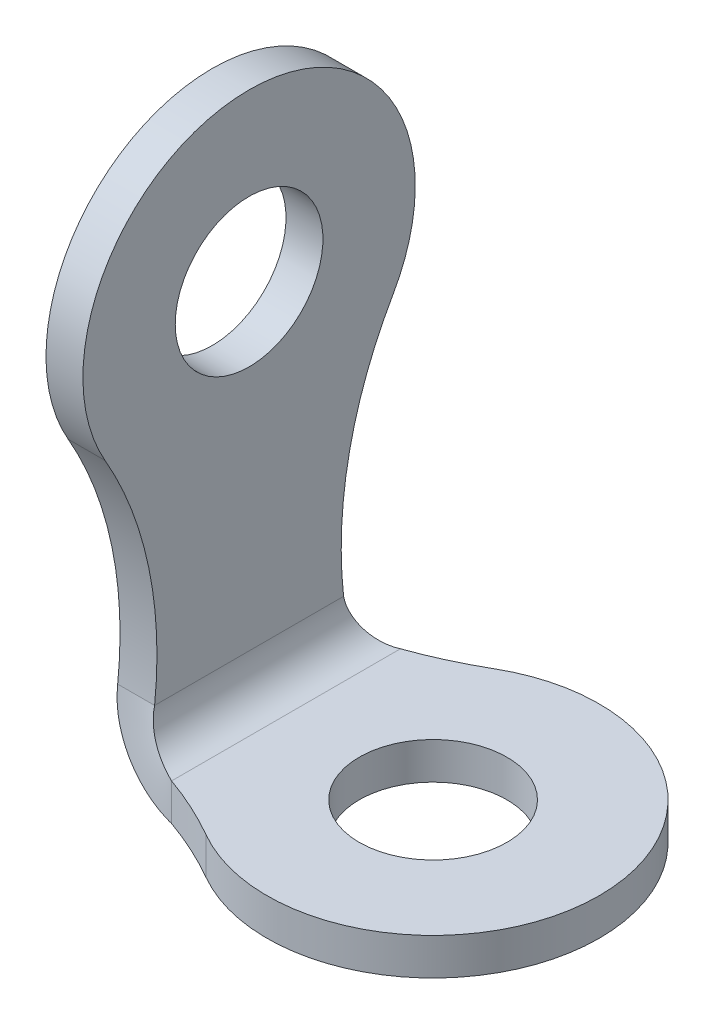
ISO-10303-21;
HEADER;
FILE_DESCRIPTION(('STEP AP214'),'2;1');
FILE_NAME('part.step','',(''),(''),'','','');
FILE_SCHEMA(('AUTOMOTIVE_DESIGN { 1 0 10303 214 1 1 1 1 }'));
ENDSEC;
DATA;
#1=APPLICATION_CONTEXT('core data for automotive mechanical design processes');
#2=APPLICATION_PROTOCOL_DEFINITION('international standard','automotive_design',2000,#1);
#3=PRODUCT_CONTEXT('',#1,'mechanical');
#4=PRODUCT('Part','Part','',(#3));
#5=PRODUCT_RELATED_PRODUCT_CATEGORY('part','',(#4));
#6=PRODUCT_DEFINITION_FORMATION('','',#4);
#7=PRODUCT_DEFINITION_CONTEXT('part definition',#1,'design');
#8=PRODUCT_DEFINITION('design','',#6,#7);
#9=PRODUCT_DEFINITION_SHAPE('','',#8);
#10=(LENGTH_UNIT() NAMED_UNIT(*) SI_UNIT(.MILLI.,.METRE.));
#11=(NAMED_UNIT(*) PLANE_ANGLE_UNIT() SI_UNIT($,.RADIAN.));
#12=(NAMED_UNIT(*) SI_UNIT($,.STERADIAN.) SOLID_ANGLE_UNIT());
#13=UNCERTAINTY_MEASURE_WITH_UNIT(LENGTH_MEASURE(1.E-05),#10,'distance_accuracy_value','');
#14=(GEOMETRIC_REPRESENTATION_CONTEXT(3) GLOBAL_UNCERTAINTY_ASSIGNED_CONTEXT((#13)) GLOBAL_UNIT_ASSIGNED_CONTEXT((#10,
#11,#12)) REPRESENTATION_CONTEXT('',''));
#15=CARTESIAN_POINT('',(0.,0.,0.));
#16=DIRECTION('',(0.,0.,1.));
#17=DIRECTION('',(1.,0.,0.));
#18=AXIS2_PLACEMENT_3D('',#15,#16,#17);
#19=CARTESIAN_POINT('',(1.51644888372476,2.16025439353241,-13.0247581574486));
#20=DIRECTION('',(1.,0.,0.));
#21=DIRECTION('',(0.,0.,1.));
#22=AXIS2_PLACEMENT_3D('',#19,#20,#21);
#23=CYLINDRICAL_SURFACE('',#22,10.529781271197);
#24=CARTESIAN_POINT('',(2.51644888372476,2.16025439353241,-13.0247581574486));
#25=DIRECTION('',(-1.,0.,0.));
#26=DIRECTION('',(0.,0.,1.));
#27=AXIS2_PLACEMENT_3D('',#24,#25,#26);
#28=CIRCLE('',#27,10.529781271197);
#29=CARTESIAN_POINT('',(2.51644888372476,1.,-2.55909509381333));
#30=VERTEX_POINT('',#29);
#31=CARTESIAN_POINT('',(2.51644888372478,7.41471273254508,-3.89968494224473));
#32=VERTEX_POINT('',#31);
#33=EDGE_CURVE('E79',#30,#32,#28,.T.);
#34=ORIENTED_EDGE('',*,*,#33,.F.);
#35=CARTESIAN_POINT('',(1.51644888372476,1.,-2.55909509381333));
#36=CARTESIAN_POINT('',(2.51644888372476,1.,-2.55909509381333));
#37=B_SPLINE_CURVE_WITH_KNOTS('',1,(#35,#36),.UNSPECIFIED.,.F.,.F.,(2,2),(0.,1.),.UNSPECIFIED.);
#38=CARTESIAN_POINT('',(1.51644888372476,1.00000000000001,-2.55909509381333));
#39=VERTEX_POINT('',#38);
#40=EDGE_CURVE('E120',#30,#39,#37,.F.);
#41=ORIENTED_EDGE('',*,*,#40,.T.);
#42=CARTESIAN_POINT('',(1.51644888372476,2.16025439353241,-13.0247581574486));
#43=DIRECTION('',(-1.,0.,0.));
#44=DIRECTION('',(0.,0.,1.));
#45=AXIS2_PLACEMENT_3D('',#42,#43,#44);
#46=CIRCLE('',#45,10.529781271197);
#47=CARTESIAN_POINT('',(1.51644888372478,7.41471273254508,-3.89968494224473));
#48=VERTEX_POINT('',#47);
#49=EDGE_CURVE('E122',#39,#48,#46,.T.);
#50=ORIENTED_EDGE('',*,*,#49,.T.);
#51=DIRECTION('',(1.,0.,0.));
#52=VECTOR('',#51,1.);
#53=CARTESIAN_POINT('',(1.51644888372478,7.41471273254508,-3.89968494224473));
#54=LINE('',#53,#52);
#55=EDGE_CURVE('E153',#48,#32,#54,.T.);
#56=ORIENTED_EDGE('',*,*,#55,.T.);
#57=EDGE_LOOP('',(#34,#41,#50,#56));
#58=FACE_BOUND('',#57,.T.);
#59=ADVANCED_FACE('F53',(#58),#23,.F.);
#60=CARTESIAN_POINT('',(1.51644888372477,2.16025439353242,13.0247581574486));
#61=DIRECTION('',(1.,0.,0.));
#62=DIRECTION('',(0.,0.,1.));
#63=AXIS2_PLACEMENT_3D('',#60,#61,#62);
#64=CYLINDRICAL_SURFACE('',#63,10.529781271197);
#65=CARTESIAN_POINT('',(1.51644888372477,2.16025439353242,13.0247581574486));
#66=DIRECTION('',(-1.,0.,0.));
#67=DIRECTION('',(0.,0.,-1.));
#68=AXIS2_PLACEMENT_3D('',#65,#66,#67);
#69=CIRCLE('',#68,10.529781271197);
#70=CARTESIAN_POINT('',(1.51644888372478,7.41471273254508,3.89968494224473));
#71=VERTEX_POINT('',#70);
#72=CARTESIAN_POINT('',(1.51644888372476,1.00000000000001,2.55909509381333));
#73=VERTEX_POINT('',#72);
#74=EDGE_CURVE('E141',#71,#73,#69,.T.);
#75=ORIENTED_EDGE('',*,*,#74,.T.);
#76=CARTESIAN_POINT('',(2.51644888372476,1.,2.55909509381333));
#77=CARTESIAN_POINT('',(1.51644888372476,1.,2.55909509381333));
#78=B_SPLINE_CURVE_WITH_KNOTS('',1,(#76,#77),.UNSPECIFIED.,.F.,.F.,(2,2),(0.,1.),.UNSPECIFIED.);
#79=CARTESIAN_POINT('',(2.51644888372476,1.,2.55909509381333));
#80=VERTEX_POINT('',#79);
#81=EDGE_CURVE('E12',#73,#80,#78,.F.);
#82=ORIENTED_EDGE('',*,*,#81,.T.);
#83=CARTESIAN_POINT('',(2.51644888372477,2.16025439353242,13.0247581574486));
#84=DIRECTION('',(-1.,0.,0.));
#85=DIRECTION('',(0.,0.,-1.));
#86=AXIS2_PLACEMENT_3D('',#83,#84,#85);
#87=CIRCLE('',#86,10.529781271197);
#88=CARTESIAN_POINT('',(2.51644888372478,7.41471273254508,3.89968494224473));
#89=VERTEX_POINT('',#88);
#90=EDGE_CURVE('E72',#89,#80,#87,.T.);
#91=ORIENTED_EDGE('',*,*,#90,.F.);
#92=DIRECTION('',(1.,0.,0.));
#93=VECTOR('',#92,1.);
#94=CARTESIAN_POINT('',(1.51644888372478,7.41471273254508,3.89968494224473));
#95=LINE('',#94,#93);
#96=EDGE_CURVE('E140',#71,#89,#95,.T.);
#97=ORIENTED_EDGE('',*,*,#96,.F.);
#98=EDGE_LOOP('',(#75,#82,#91,#97));
#99=FACE_BOUND('',#98,.T.);
#100=ADVANCED_FACE('F55',(#99),#64,.F.);
#101=CARTESIAN_POINT('',(2.51644888372478,5.91025439353241,6.51237907872431));
#102=DIRECTION('',(1.,0.,0.));
#103=DIRECTION('',(0.,0.,1.));
#104=AXIS2_PLACEMENT_3D('',#101,#102,#103);
#105=PLANE('',#104);
#106=CARTESIAN_POINT('',(2.51644888372479,9.66025439353241,0.));
#107=DIRECTION('',(1.,0.,0.));
#108=DIRECTION('',(0.,0.,1.));
#109=AXIS2_PLACEMENT_3D('',#106,#107,#108);
#110=CIRCLE('',#109,2.);
#111=CARTESIAN_POINT('',(2.51644888372479,9.66025439353241,2.));
#112=VERTEX_POINT('',#111);
#113=EDGE_CURVE('E248',#112,#112,#110,.T.);
#114=ORIENTED_EDGE('',*,*,#113,.F.);
#115=EDGE_LOOP('',(#114));
#116=FACE_BOUND('',#115,.T.);
#117=ORIENTED_EDGE('',*,*,#90,.T.);
#118=DIRECTION('',(0.,0.,-1.));
#119=VECTOR('',#118,1.);
#120=CARTESIAN_POINT('',(2.51644888372476,1.,6.51237907872431));
#121=LINE('',#120,#119);
#122=EDGE_CURVE('E65',#80,#30,#121,.T.);
#123=ORIENTED_EDGE('',*,*,#122,.T.);
#124=ORIENTED_EDGE('',*,*,#33,.T.);
#125=CARTESIAN_POINT('',(2.51644888372479,9.66025439353241,0.));
#126=DIRECTION('',(1.,0.,0.));
#127=DIRECTION('',(0.,0.,1.));
#128=AXIS2_PLACEMENT_3D('',#125,#126,#127);
#129=CIRCLE('',#128,4.5);
#130=EDGE_CURVE('E324',#32,#89,#129,.T.);
#131=ORIENTED_EDGE('',*,*,#130,.T.);
#132=EDGE_LOOP('',(#117,#123,#124,#131));
#133=FACE_BOUND('',#132,.T.);
#134=ADVANCED_FACE('F356',(#116,#133),#105,.T.);
#135=CARTESIAN_POINT('',(1.51644888372479,9.66025439353242,0.));
#136=DIRECTION('',(1.,0.,0.));
#137=DIRECTION('',(0.,0.,1.));
#138=AXIS2_PLACEMENT_3D('',#135,#136,#137);
#139=CYLINDRICAL_SURFACE('',#138,4.5);
#140=ORIENTED_EDGE('',*,*,#130,.F.);
#141=ORIENTED_EDGE('',*,*,#55,.F.);
#142=CARTESIAN_POINT('',(1.51644888372479,9.66025439353242,0.));
#143=DIRECTION('',(1.,0.,0.));
#144=DIRECTION('',(0.,0.,1.));
#145=AXIS2_PLACEMENT_3D('',#142,#143,#144);
#146=CIRCLE('',#145,4.5);
#147=EDGE_CURVE('E139',#48,#71,#146,.T.);
#148=ORIENTED_EDGE('',*,*,#147,.T.);
#149=ORIENTED_EDGE('',*,*,#96,.T.);
#150=EDGE_LOOP('',(#140,#141,#148,#149));
#151=FACE_BOUND('',#150,.T.);
#152=ADVANCED_FACE('F359',(#151),#139,.T.);
#153=CARTESIAN_POINT('',(1.51644888372478,5.91025439353242,6.51237907872431));
#154=DIRECTION('',(1.,0.,0.));
#155=DIRECTION('',(0.,0.,1.));
#156=AXIS2_PLACEMENT_3D('',#153,#154,#155);
#157=PLANE('',#156);
#158=DIRECTION('',(0.,0.,-1.));
#159=VECTOR('',#158,1.);
#160=CARTESIAN_POINT('',(1.51644888372476,1.00000000000001,6.51237907872431));
#161=LINE('',#160,#159);
#162=EDGE_CURVE('E129',#73,#39,#161,.T.);
#163=ORIENTED_EDGE('',*,*,#162,.F.);
#164=ORIENTED_EDGE('',*,*,#74,.F.);
#165=ORIENTED_EDGE('',*,*,#147,.F.);
#166=ORIENTED_EDGE('',*,*,#49,.F.);
#167=EDGE_LOOP('',(#163,#164,#165,#166));
#168=FACE_BOUND('',#167,.T.);
#169=CARTESIAN_POINT('',(1.51644888372479,9.66025439353241,0.));
#170=DIRECTION('',(1.,0.,0.));
#171=DIRECTION('',(0.,0.,1.));
#172=AXIS2_PLACEMENT_3D('',#169,#170,#171);
#173=CIRCLE('',#172,2.);
#174=CARTESIAN_POINT('',(1.51644888372479,9.66025439353241,2.));
#175=VERTEX_POINT('',#174);
#176=EDGE_CURVE('E321',#175,#175,#173,.T.);
#177=ORIENTED_EDGE('',*,*,#176,.T.);
#178=EDGE_LOOP('',(#177));
#179=FACE_BOUND('',#178,.T.);
#180=ADVANCED_FACE('F134',(#168,#179),#157,.F.);
#181=CARTESIAN_POINT('',(1.51644888372479,9.66025439353241,0.));
#182=DIRECTION('',(1.,0.,0.));
#183=DIRECTION('',(0.,0.,1.));
#184=AXIS2_PLACEMENT_3D('',#181,#182,#183);
#185=CYLINDRICAL_SURFACE('',#184,2.);
#186=ORIENTED_EDGE('',*,*,#176,.F.);
#187=EDGE_LOOP('',(#186));
#188=FACE_BOUND('',#187,.T.);
#189=ORIENTED_EDGE('',*,*,#113,.T.);
#190=EDGE_LOOP('',(#189));
#191=FACE_BOUND('',#190,.T.);
#192=ADVANCED_FACE('F305',(#188,#191),#185,.F.);
#193=CARTESIAN_POINT('',(7.5,-1.,0.));
#194=DIRECTION('',(0.,1.,0.));
#195=DIRECTION('',(0.,0.,1.));
#196=AXIS2_PLACEMENT_3D('',#193,#194,#195);
#197=CYLINDRICAL_SURFACE('',#196,4.5);
#198=CARTESIAN_POINT('',(7.5,0.,0.));
#199=DIRECTION('',(0.,1.,0.));
#200=DIRECTION('',(0.,0.,-1.));
#201=AXIS2_PLACEMENT_3D('',#198,#199,#200);
#202=CIRCLE('',#201,4.5);
#203=CARTESIAN_POINT('',(5.25445833901267,0.,3.89968494224473));
#204=VERTEX_POINT('',#203);
#205=CARTESIAN_POINT('',(5.25445833901267,0.,-3.89968494224473));
#206=VERTEX_POINT('',#205);
#207=EDGE_CURVE('E250',#204,#206,#202,.T.);
#208=ORIENTED_EDGE('',*,*,#207,.F.);
#209=DIRECTION('',(0.,1.,0.));
#210=VECTOR('',#209,1.);
#211=CARTESIAN_POINT('',(5.25445833901267,-1.,3.89968494224473));
#212=LINE('',#211,#210);
#213=CARTESIAN_POINT('',(5.25445833901267,-1.,3.89968494224473));
#214=VERTEX_POINT('',#213);
#215=EDGE_CURVE('E240',#214,#204,#212,.T.);
#216=ORIENTED_EDGE('',*,*,#215,.F.);
#217=CARTESIAN_POINT('',(7.5,-1.,0.));
#218=DIRECTION('',(0.,1.,0.));
#219=DIRECTION('',(0.,0.,-1.));
#220=AXIS2_PLACEMENT_3D('',#217,#218,#219);
#221=CIRCLE('',#220,4.5);
#222=CARTESIAN_POINT('',(5.25445833901267,-1.,-3.89968494224473));
#223=VERTEX_POINT('',#222);
#224=EDGE_CURVE('E264',#214,#223,#221,.T.);
#225=ORIENTED_EDGE('',*,*,#224,.T.);
#226=DIRECTION('',(0.,1.,0.));
#227=VECTOR('',#226,1.);
#228=CARTESIAN_POINT('',(5.25445833901267,-1.,-3.89968494224473));
#229=LINE('',#228,#227);
#230=EDGE_CURVE('E262',#223,#206,#229,.T.);
#231=ORIENTED_EDGE('',*,*,#230,.T.);
#232=EDGE_LOOP('',(#208,#216,#225,#231));
#233=FACE_BOUND('',#232,.T.);
#234=ADVANCED_FACE('F386',(#233),#197,.T.);
#235=CARTESIAN_POINT('',(7.5,-1.,0.));
#236=DIRECTION('',(0.,1.,0.));
#237=DIRECTION('',(0.,0.,1.));
#238=AXIS2_PLACEMENT_3D('',#235,#236,#237);
#239=CYLINDRICAL_SURFACE('',#238,2.);
#240=CARTESIAN_POINT('',(7.5,-1.,0.));
#241=DIRECTION('',(0.,1.,0.));
#242=DIRECTION('',(0.,0.,1.));
#243=AXIS2_PLACEMENT_3D('',#240,#241,#242);
#244=CIRCLE('',#243,2.);
#245=CARTESIAN_POINT('',(7.5,-1.,2.));
#246=VERTEX_POINT('',#245);
#247=EDGE_CURVE('E255',#246,#246,#244,.T.);
#248=ORIENTED_EDGE('',*,*,#247,.F.);
#249=EDGE_LOOP('',(#248));
#250=FACE_BOUND('',#249,.T.);
#251=CARTESIAN_POINT('',(7.5,0.,0.));
#252=DIRECTION('',(0.,1.,0.));
#253=DIRECTION('',(0.,0.,1.));
#254=AXIS2_PLACEMENT_3D('',#251,#252,#253);
#255=CIRCLE('',#254,2.);
#256=CARTESIAN_POINT('',(7.5,0.,2.));
#257=VERTEX_POINT('',#256);
#258=EDGE_CURVE('E259',#257,#257,#255,.T.);
#259=ORIENTED_EDGE('',*,*,#258,.T.);
#260=EDGE_LOOP('',(#259));
#261=FACE_BOUND('',#260,.T.);
#262=ADVANCED_FACE('F393',(#250,#261),#239,.F.);
#263=CARTESIAN_POINT('',(-3.75,-1.,6.51237907872431));
#264=DIRECTION('',(0.,1.,0.));
#265=DIRECTION('',(0.,0.,1.));
#266=AXIS2_PLACEMENT_3D('',#263,#264,#265);
#267=PLANE('',#266);
#268=ORIENTED_EDGE('',*,*,#247,.T.);
#269=EDGE_LOOP('',(#268));
#270=FACE_BOUND('',#269,.T.);
#271=CARTESIAN_POINT('',(0.,-1.,13.0247581574486));
#272=DIRECTION('',(0.,-1.,0.));
#273=DIRECTION('',(0.,0.,-1.));
#274=AXIS2_PLACEMENT_3D('',#271,#272,#273);
#275=CIRCLE('',#274,10.529781271197);
#276=CARTESIAN_POINT('',(3.51644888372476,-1.,3.0994933817662));
#277=VERTEX_POINT('',#276);
#278=EDGE_CURVE('E249',#277,#214,#275,.T.);
#279=ORIENTED_EDGE('',*,*,#278,.F.);
#280=DIRECTION('',(0.,0.,-1.));
#281=VECTOR('',#280,1.);
#282=CARTESIAN_POINT('',(3.51644888372476,-1.,6.51237907872431));
#283=LINE('',#282,#281);
#284=CARTESIAN_POINT('',(3.51644888372476,-1.,-3.0994933817662));
#285=VERTEX_POINT('',#284);
#286=EDGE_CURVE('E258',#277,#285,#283,.T.);
#287=ORIENTED_EDGE('',*,*,#286,.T.);
#288=CARTESIAN_POINT('',(0.,-1.,-13.0247581574486));
#289=DIRECTION('',(0.,-1.,0.));
#290=DIRECTION('',(0.,0.,1.));
#291=AXIS2_PLACEMENT_3D('',#288,#289,#290);
#292=CIRCLE('',#291,10.529781271197);
#293=EDGE_CURVE('E267',#223,#285,#292,.T.);
#294=ORIENTED_EDGE('',*,*,#293,.F.);
#295=ORIENTED_EDGE('',*,*,#224,.F.);
#296=EDGE_LOOP('',(#279,#287,#294,#295));
#297=FACE_BOUND('',#296,.T.);
#298=ADVANCED_FACE('F295',(#270,#297),#267,.F.);
#299=CARTESIAN_POINT('',(0.,-1.,-13.0247581574486));
#300=DIRECTION('',(0.,1.,0.));
#301=DIRECTION('',(0.,0.,1.));
#302=AXIS2_PLACEMENT_3D('',#299,#300,#301);
#303=CYLINDRICAL_SURFACE('',#302,10.529781271197);
#304=CARTESIAN_POINT('',(3.51644888372476,0.,-3.0994933817662));
#305=CARTESIAN_POINT('',(3.51644888372476,-1.,-3.0994933817662));
#306=B_SPLINE_CURVE_WITH_KNOTS('',1,(#304,#305),.UNSPECIFIED.,.F.,.F.,(2,2),(0.,1.),.UNSPECIFIED.);
#307=CARTESIAN_POINT('',(3.51644888372476,0.,-3.0994933817662));
#308=VERTEX_POINT('',#307);
#309=EDGE_CURVE('E159',#308,#285,#306,.T.);
#310=ORIENTED_EDGE('',*,*,#309,.F.);
#311=CARTESIAN_POINT('',(0.,0.,-13.0247581574486));
#312=DIRECTION('',(0.,-1.,0.));
#313=DIRECTION('',(0.,0.,1.));
#314=AXIS2_PLACEMENT_3D('',#311,#312,#313);
#315=CIRCLE('',#314,10.529781271197);
#316=EDGE_CURVE('E253',#206,#308,#315,.T.);
#317=ORIENTED_EDGE('',*,*,#316,.F.);
#318=ORIENTED_EDGE('',*,*,#230,.F.);
#319=ORIENTED_EDGE('',*,*,#293,.T.);
#320=EDGE_LOOP('',(#310,#317,#318,#319));
#321=FACE_BOUND('',#320,.T.);
#322=ADVANCED_FACE('F284',(#321),#303,.F.);
#323=CARTESIAN_POINT('',(-3.75,0.,6.51237907872431));
#324=DIRECTION('',(0.,1.,0.));
#325=DIRECTION('',(0.,0.,1.));
#326=AXIS2_PLACEMENT_3D('',#323,#324,#325);
#327=PLANE('',#326);
#328=DIRECTION('',(0.,0.,-1.));
#329=VECTOR('',#328,1.);
#330=CARTESIAN_POINT('',(3.51644888372476,0.,6.51237907872431));
#331=LINE('',#330,#329);
#332=CARTESIAN_POINT('',(3.51644888372476,0.,3.0994933817662));
#333=VERTEX_POINT('',#332);
#334=EDGE_CURVE('E282',#333,#308,#331,.T.);
#335=ORIENTED_EDGE('',*,*,#334,.F.);
#336=CARTESIAN_POINT('',(0.,0.,13.0247581574486));
#337=DIRECTION('',(0.,-1.,0.));
#338=DIRECTION('',(0.,0.,-1.));
#339=AXIS2_PLACEMENT_3D('',#336,#337,#338);
#340=CIRCLE('',#339,10.529781271197);
#341=EDGE_CURVE('E254',#333,#204,#340,.T.);
#342=ORIENTED_EDGE('',*,*,#341,.T.);
#343=ORIENTED_EDGE('',*,*,#207,.T.);
#344=ORIENTED_EDGE('',*,*,#316,.T.);
#345=EDGE_LOOP('',(#335,#342,#343,#344));
#346=FACE_BOUND('',#345,.T.);
#347=ORIENTED_EDGE('',*,*,#258,.F.);
#348=EDGE_LOOP('',(#347));
#349=FACE_BOUND('',#348,.T.);
#350=ADVANCED_FACE('F294',(#346,#349),#327,.T.);
#351=CARTESIAN_POINT('',(0.,-1.,13.0247581574486));
#352=DIRECTION('',(0.,1.,0.));
#353=DIRECTION('',(0.,0.,1.));
#354=AXIS2_PLACEMENT_3D('',#351,#352,#353);
#355=CYLINDRICAL_SURFACE('',#354,10.529781271197);
#356=CARTESIAN_POINT('',(3.51644888372476,-1.,3.0994933817662));
#357=CARTESIAN_POINT('',(3.51644888372476,0.,3.0994933817662));
#358=B_SPLINE_CURVE_WITH_KNOTS('',1,(#356,#357),.UNSPECIFIED.,.F.,.F.,(2,2),(0.,1.),.UNSPECIFIED.);
#359=EDGE_CURVE('E162',#277,#333,#358,.T.);
#360=ORIENTED_EDGE('',*,*,#359,.F.);
#361=ORIENTED_EDGE('',*,*,#278,.T.);
#362=ORIENTED_EDGE('',*,*,#215,.T.);
#363=ORIENTED_EDGE('',*,*,#341,.F.);
#364=EDGE_LOOP('',(#360,#361,#362,#363));
#365=FACE_BOUND('',#364,.T.);
#366=ADVANCED_FACE('F299',(#365),#355,.F.);
#367=CARTESIAN_POINT('',(3.51644888372476,-1.,3.0994933817662));
#368=CARTESIAN_POINT('',(3.33625896503536,-1.,3.05404897940729));
#369=CARTESIAN_POINT('',(3.13421200548688,-0.975551879634531,3.00856439108511));
#370=CARTESIAN_POINT('',(2.71181808777936,-0.84431004509243,2.91800509012786));
#371=CARTESIAN_POINT('',(2.49100141303331,-0.736950317166419,2.87284866955717));
#372=CARTESIAN_POINT('',(2.07847887638742,-0.414489723345589,2.78278228823169));
#373=CARTESIAN_POINT('',(1.88707496106511,-0.198587445476027,2.7378723274769));
#374=CARTESIAN_POINT('',(1.60553035542757,0.336779356091399,2.6482988657832));
#375=CARTESIAN_POINT('',(1.51644888372476,0.655956943942264,2.60375975805689));
#376=CARTESIAN_POINT('',(1.51644888372476,1.,2.55909509381333));
#377=CARTESIAN_POINT('',(3.51644888372476,0.,3.0994933817662));
#378=CARTESIAN_POINT('',(3.42632928324558,0.,3.05403655028098));
#379=CARTESIAN_POINT('',(3.32533044460582,0.0122240601827343,3.00856439108511));
#380=CARTESIAN_POINT('',(3.11413348575206,0.077844977453785,2.91800509012786));
#381=CARTESIAN_POINT('',(3.00372514837903,0.13152484141679,2.87284866955717));
#382=CARTESIAN_POINT('',(2.79746388005609,0.292755138327205,2.78278228823169));
#383=CARTESIAN_POINT('',(2.70176192239493,0.400706277261986,2.7378723274769));
#384=CARTESIAN_POINT('',(2.56098961957616,0.6683896780457,2.6482988657832));
#385=CARTESIAN_POINT('',(2.51644888372476,0.828001165683141,2.60375386573028));
#386=CARTESIAN_POINT('',(2.51644888372476,1.,2.55909509381333));
#387=B_SPLINE_SURFACE_WITH_KNOTS('',1,3,((#367,#368,#369,#370,#371,#372,#373,#374,#375,#376),
(#377,#378,#379,#380,#381,#382,#383,#384,#385,#386)),.UNSPECIFIED.,.F.,.F.,.F.,(2,2),(4,2,2,2,
4),(0.,1.),(0.,0.25,0.5,0.75,1.),.UNSPECIFIED.);
#388=CARTESIAN_POINT('',(3.51644888372476,0.,3.0994933817662));
#389=CARTESIAN_POINT('',(3.42632928324558,0.,3.05403655028098));
#390=CARTESIAN_POINT('',(3.32533044460582,0.0122240601827343,3.00856439108511));
#391=CARTESIAN_POINT('',(3.11413348575206,0.077844977453785,2.91800509012786));
#392=CARTESIAN_POINT('',(3.00372514837903,0.13152484141679,2.87284866955717));
#393=CARTESIAN_POINT('',(2.79746388005609,0.292755138327205,2.78278228823169));
#394=CARTESIAN_POINT('',(2.70176192239493,0.400706277261986,2.7378723274769));
#395=CARTESIAN_POINT('',(2.56098961957616,0.6683896780457,2.6482988657832));
#396=CARTESIAN_POINT('',(2.51644888372476,0.828001165683141,2.60375386573028));
#397=CARTESIAN_POINT('',(2.51644888372476,1.,2.55909509381333));
#398=B_SPLINE_CURVE_WITH_KNOTS('',3,(#388,#389,#390,#391,#392,#393,#394,#395,#396,#397),
.UNSPECIFIED.,.F.,.F.,(4,2,2,2,4),(0.,0.25,0.5,0.75,1.),.UNSPECIFIED.);
#399=EDGE_CURVE('E513',#333,#80,#398,.T.);
#400=CARTESIAN_POINT('',(1.51644888372476,1.,2.55909509381333));
#401=CARTESIAN_POINT('',(1.51644888372476,0.655956943942264,2.60375975805689));
#402=CARTESIAN_POINT('',(1.60553035542757,0.336779356091399,2.6482988657832));
#403=CARTESIAN_POINT('',(1.88707496106511,-0.198587445476027,2.7378723274769));
#404=CARTESIAN_POINT('',(2.07847887638742,-0.414489723345589,2.78278228823169));
#405=CARTESIAN_POINT('',(2.49100141303331,-0.736950317166419,2.87284866955717));
#406=CARTESIAN_POINT('',(2.71181808777936,-0.84431004509243,2.91800509012786));
#407=CARTESIAN_POINT('',(3.13421200548688,-0.975551879634531,3.00856439108511));
#408=CARTESIAN_POINT('',(3.33625896503536,-1.,3.05404897940729));
#409=CARTESIAN_POINT('',(3.51644888372476,-1.,3.0994933817662));
#410=B_SPLINE_CURVE_WITH_KNOTS('',3,(#400,#401,#402,#403,#404,#405,#406,#407,#408,#409),
.UNSPECIFIED.,.F.,.F.,(4,2,2,2,4),(0.,0.25,0.5,0.75,1.),.UNSPECIFIED.);
#411=EDGE_CURVE('E151',#277,#73,#410,.F.);
#412=ORIENTED_EDGE('',*,*,#359,.T.);
#413=ORIENTED_EDGE('',*,*,#399,.T.);
#414=ORIENTED_EDGE('',*,*,#81,.F.);
#415=ORIENTED_EDGE('',*,*,#411,.F.);
#416=EDGE_LOOP('',(#412,#413,#414,#415));
#417=FACE_BOUND('',#416,.T.);
#418=ADVANCED_FACE('F184',(#417),#387,.T.);
#419=CARTESIAN_POINT('',(1.51644888372476,1.,-2.55909509381333));
#420=CARTESIAN_POINT('',(1.51644888372476,0.793270887662321,-2.57696776305979));
#421=CARTESIAN_POINT('',(1.54885479400145,0.571613592154268,-2.60167038478852));
#422=CARTESIAN_POINT('',(1.70122513434201,0.128275183318763,-2.66459900019956));
#423=CARTESIAN_POINT('',(1.8215860404358,-0.0936081848132238,-2.70284774938368));
#424=CARTESIAN_POINT('',(2.16017244114971,-0.49300138337779,-2.79291413070916));
#425=CARTESIAN_POINT('',(2.378818165105,-0.670160075547346,-2.84473176285051));
#426=CARTESIAN_POINT('',(2.89854091947896,-0.924013533637756,-2.96193591009044));
#427=CARTESIAN_POINT('',(3.1992692883672,-1.,-3.02719177703321));
#428=CARTESIAN_POINT('',(3.51644888372476,-1.,-3.0994933817662));
#429=CARTESIAN_POINT('',(2.51644888372476,1.,-2.55909509381333));
#430=CARTESIAN_POINT('',(2.51644888372476,0.896632578522374,-2.57696825849767));
#431=CARTESIAN_POINT('',(2.5326518388631,0.785806796077134,-2.60167038478852));
#432=CARTESIAN_POINT('',(2.60883700903339,0.564137591659382,-2.66459900019956));
#433=CARTESIAN_POINT('',(2.66901746208028,0.453195907593388,-2.70284774938368));
#434=CARTESIAN_POINT('',(2.83831066243723,0.253499308311105,-2.79291413070916));
#435=CARTESIAN_POINT('',(2.94763352441488,0.164919962226327,-2.84473176285051));
#436=CARTESIAN_POINT('',(3.20749490160186,0.0379932331811219,-2.96193591009044));
#437=CARTESIAN_POINT('',(3.35789607099585,0.,-3.02720863859218));
#438=CARTESIAN_POINT('',(3.51644888372476,0.,-3.0994933817662));
#439=B_SPLINE_SURFACE_WITH_KNOTS('',1,3,((#419,#420,#421,#422,#423,#424,#425,#426,#427,#428),
(#429,#430,#431,#432,#433,#434,#435,#436,#437,#438)),.UNSPECIFIED.,.F.,.F.,.F.,(2,2),(4,2,2,2,
4),(0.,1.),(0.,0.25,0.5,0.75,1.),.UNSPECIFIED.);
#440=CARTESIAN_POINT('',(2.51644888372476,1.,-2.55909509381333));
#441=CARTESIAN_POINT('',(2.51644888372476,0.896632578522374,-2.57696825849767));
#442=CARTESIAN_POINT('',(2.5326518388631,0.785806796077134,-2.60167038478852));
#443=CARTESIAN_POINT('',(2.60883700903339,0.564137591659382,-2.66459900019956));
#444=CARTESIAN_POINT('',(2.66901746208028,0.453195907593388,-2.70284774938368));
#445=CARTESIAN_POINT('',(2.83831066243723,0.253499308311105,-2.79291413070916));
#446=CARTESIAN_POINT('',(2.94763352441488,0.164919962226327,-2.84473176285051));
#447=CARTESIAN_POINT('',(3.20749490160186,0.0379932331811219,-2.96193591009044));
#448=CARTESIAN_POINT('',(3.35789607099585,0.,-3.02720863859218));
#449=CARTESIAN_POINT('',(3.51644888372476,0.,-3.0994933817662));
#450=B_SPLINE_CURVE_WITH_KNOTS('',3,(#440,#441,#442,#443,#444,#445,#446,#447,#448,#449),
.UNSPECIFIED.,.F.,.F.,(4,2,2,2,4),(0.,0.25,0.5,0.75,1.),.UNSPECIFIED.);
#451=EDGE_CURVE('E511',#30,#308,#450,.T.);
#452=CARTESIAN_POINT('',(3.51644888372476,-1.,-3.0994933817662));
#453=CARTESIAN_POINT('',(3.1992692883672,-1.,-3.02719177703321));
#454=CARTESIAN_POINT('',(2.89854091947896,-0.924013533637756,-2.96193591009044));
#455=CARTESIAN_POINT('',(2.378818165105,-0.670160075547346,-2.84473176285051));
#456=CARTESIAN_POINT('',(2.16017244114971,-0.49300138337779,-2.79291413070916));
#457=CARTESIAN_POINT('',(1.8215860404358,-0.0936081848132238,-2.70284774938368));
#458=CARTESIAN_POINT('',(1.70122513434201,0.128275183318763,-2.66459900019956));
#459=CARTESIAN_POINT('',(1.54885479400145,0.571613592154268,-2.60167038478852));
#460=CARTESIAN_POINT('',(1.51644888372476,0.793270887662321,-2.57696776305979));
#461=CARTESIAN_POINT('',(1.51644888372476,1.,-2.55909509381333));
#462=B_SPLINE_CURVE_WITH_KNOTS('',3,(#452,#453,#454,#455,#456,#457,#458,#459,#460,#461),
.UNSPECIFIED.,.F.,.F.,(4,2,2,2,4),(0.,0.25,0.5,0.75,1.),.UNSPECIFIED.);
#463=EDGE_CURVE('E148',#39,#285,#462,.F.);
#464=ORIENTED_EDGE('',*,*,#40,.F.);
#465=ORIENTED_EDGE('',*,*,#451,.T.);
#466=ORIENTED_EDGE('',*,*,#309,.T.);
#467=ORIENTED_EDGE('',*,*,#463,.F.);
#468=EDGE_LOOP('',(#464,#465,#466,#467));
#469=FACE_BOUND('',#468,.T.);
#470=ADVANCED_FACE('F157',(#469),#439,.T.);
#471=CARTESIAN_POINT('',(3.51644888372476,1.,6.70664516506299));
#472=DIRECTION('',(0.,0.,-1.));
#473=DIRECTION('',(-1.,0.,0.));
#474=AXIS2_PLACEMENT_3D('',#471,#472,#473);
#475=CYLINDRICAL_SURFACE('',#474,2.);
#476=ORIENTED_EDGE('',*,*,#463,.T.);
#477=ORIENTED_EDGE('',*,*,#286,.F.);
#478=ORIENTED_EDGE('',*,*,#411,.T.);
#479=ORIENTED_EDGE('',*,*,#162,.T.);
#480=EDGE_LOOP('',(#476,#477,#478,#479));
#481=FACE_BOUND('',#480,.T.);
#482=ADVANCED_FACE('F146',(#481),#475,.T.);
#483=CARTESIAN_POINT('',(3.51644888372476,1.,6.70664516506299));
#484=DIRECTION('',(0.,0.,-1.));
#485=DIRECTION('',(-1.,0.,0.));
#486=AXIS2_PLACEMENT_3D('',#483,#484,#485);
#487=CYLINDRICAL_SURFACE('',#486,1.);
#488=ORIENTED_EDGE('',*,*,#451,.F.);
#489=ORIENTED_EDGE('',*,*,#122,.F.);
#490=ORIENTED_EDGE('',*,*,#399,.F.);
#491=ORIENTED_EDGE('',*,*,#334,.T.);
#492=EDGE_LOOP('',(#488,#489,#490,#491));
#493=FACE_BOUND('',#492,.T.);
#494=ADVANCED_FACE('F185',(#493),#487,.F.);
#495=CLOSED_SHELL('',(#59,#100,#134,#152,#180,#192,#234,#262,#298,#322,#350,#366,#418,#470,#482,#494));
#496=MANIFOLD_SOLID_BREP('B2',#495);
#497=ADVANCED_BREP_SHAPE_REPRESENTATION('',(#18,#496),#14);
#498=SHAPE_DEFINITION_REPRESENTATION(#9,#497);
ENDSEC;
END-ISO-10303-21;
